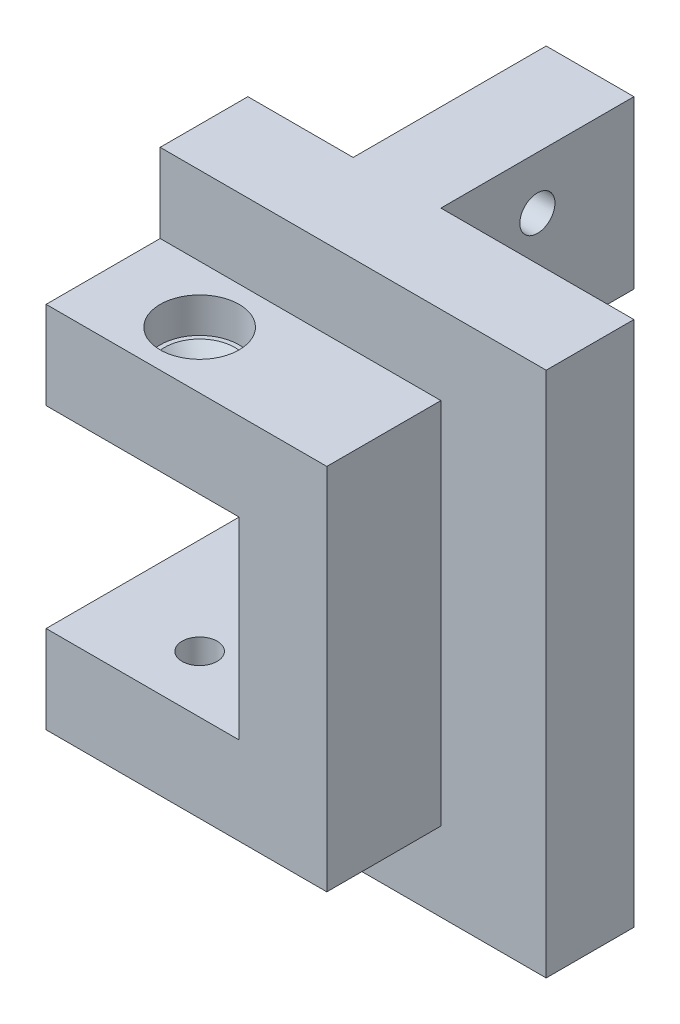
ISO-10303-21;
HEADER;
FILE_DESCRIPTION(('STEP AP214'),'2;1');
FILE_NAME('part.step','',(''),(''),'','','');
FILE_SCHEMA(('AUTOMOTIVE_DESIGN { 1 0 10303 214 1 1 1 1 }'));
ENDSEC;
DATA;
#1=APPLICATION_CONTEXT('core data for automotive mechanical design processes');
#2=APPLICATION_PROTOCOL_DEFINITION('international standard','automotive_design',2000,#1);
#3=PRODUCT_CONTEXT('',#1,'mechanical');
#4=PRODUCT('Part','Part','',(#3));
#5=PRODUCT_RELATED_PRODUCT_CATEGORY('part','',(#4));
#6=PRODUCT_DEFINITION_FORMATION('','',#4);
#7=PRODUCT_DEFINITION_CONTEXT('part definition',#1,'design');
#8=PRODUCT_DEFINITION('design','',#6,#7);
#9=PRODUCT_DEFINITION_SHAPE('','',#8);
#10=(LENGTH_UNIT() NAMED_UNIT(*) SI_UNIT(.MILLI.,.METRE.));
#11=(NAMED_UNIT(*) PLANE_ANGLE_UNIT() SI_UNIT($,.RADIAN.));
#12=(NAMED_UNIT(*) SI_UNIT($,.STERADIAN.) SOLID_ANGLE_UNIT());
#13=UNCERTAINTY_MEASURE_WITH_UNIT(LENGTH_MEASURE(1.E-05),#10,'distance_accuracy_value','');
#14=(GEOMETRIC_REPRESENTATION_CONTEXT(3) GLOBAL_UNCERTAINTY_ASSIGNED_CONTEXT((#13)) GLOBAL_UNIT_ASSIGNED_CONTEXT((#10,
#11,#12)) REPRESENTATION_CONTEXT('',''));
#15=CARTESIAN_POINT('',(0.,0.,0.));
#16=DIRECTION('',(0.,0.,1.));
#17=DIRECTION('',(1.,0.,0.));
#18=AXIS2_PLACEMENT_3D('',#15,#16,#17);
#19=CARTESIAN_POINT('',(-33.0000000000001,0.,16.5));
#20=DIRECTION('',(0.,-1.,0.));
#21=DIRECTION('',(0.,0.,-1.));
#22=AXIS2_PLACEMENT_3D('',#19,#20,#21);
#23=CYLINDRICAL_SURFACE('',#22,2.);
#24=CARTESIAN_POINT('',(-33.0000000000001,-15.,16.5));
#25=DIRECTION('',(0.,-1.,0.));
#26=DIRECTION('',(0.,0.,-1.));
#27=AXIS2_PLACEMENT_3D('',#24,#25,#26);
#28=CIRCLE('',#27,2.);
#29=CARTESIAN_POINT('',(-33.0000000000001,-15.,14.5));
#30=VERTEX_POINT('',#29);
#31=EDGE_CURVE('E394',#30,#30,#28,.T.);
#32=ORIENTED_EDGE('',*,*,#31,.T.);
#33=EDGE_LOOP('',(#32));
#34=FACE_BOUND('',#33,.T.);
#35=CARTESIAN_POINT('',(-33.0000000000001,-11.,16.5));
#36=DIRECTION('',(0.,-1.,0.));
#37=DIRECTION('',(1.,0.,0.));
#38=AXIS2_PLACEMENT_3D('',#35,#36,#37);
#39=CIRCLE('',#38,2.);
#40=CARTESIAN_POINT('',(-31.0000000000001,-11.,16.5));
#41=VERTEX_POINT('',#40);
#42=EDGE_CURVE('E305',#41,#41,#39,.T.);
#43=ORIENTED_EDGE('',*,*,#42,.F.);
#44=EDGE_LOOP('',(#43));
#45=FACE_BOUND('',#44,.T.);
#46=ADVANCED_FACE('F39',(#34,#45),#23,.F.);
#47=CARTESIAN_POINT('',(0.,0.,0.));
#48=DIRECTION('',(0.,0.,1.));
#49=DIRECTION('',(1.,0.,0.));
#50=AXIS2_PLACEMENT_3D('',#47,#48,#49);
#51=PLANE('',#50);
#52=DIRECTION('',(-1.,0.,0.));
#53=VECTOR('',#52,1.);
#54=CARTESIAN_POINT('',(0.,-30.,0.));
#55=LINE('',#54,#53);
#56=CARTESIAN_POINT('',(0.,-30.,0.));
#57=VERTEX_POINT('',#56);
#58=CARTESIAN_POINT('',(-22.,-30.,0.));
#59=VERTEX_POINT('',#58);
#60=EDGE_CURVE('E357',#57,#59,#55,.T.);
#61=ORIENTED_EDGE('',*,*,#60,.T.);
#62=DIRECTION('',(0.,1.,0.));
#63=VECTOR('',#62,1.);
#64=CARTESIAN_POINT('',(-22.,0.,0.));
#65=LINE('',#64,#63);
#66=CARTESIAN_POINT('',(-22.,-11.,0.));
#67=VERTEX_POINT('',#66);
#68=EDGE_CURVE('E388',#59,#67,#65,.T.);
#69=ORIENTED_EDGE('',*,*,#68,.T.);
#70=DIRECTION('',(0.,-1.,0.));
#71=VECTOR('',#70,1.);
#72=CARTESIAN_POINT('',(-22.,0.,0.));
#73=LINE('',#72,#71);
#74=CARTESIAN_POINT('',(-22.,11.,0.));
#75=VERTEX_POINT('',#74);
#76=EDGE_CURVE('E364',#75,#67,#73,.T.);
#77=ORIENTED_EDGE('',*,*,#76,.F.);
#78=DIRECTION('',(0.,-1.,0.));
#79=VECTOR('',#78,1.);
#80=CARTESIAN_POINT('',(-22.,0.,0.));
#81=LINE('',#80,#79);
#82=CARTESIAN_POINT('',(-22.,30.,0.));
#83=VERTEX_POINT('',#82);
#84=EDGE_CURVE('E275',#83,#75,#81,.T.);
#85=ORIENTED_EDGE('',*,*,#84,.F.);
#86=DIRECTION('',(-1.,0.,0.));
#87=VECTOR('',#86,1.);
#88=CARTESIAN_POINT('',(0.,30.,0.));
#89=LINE('',#88,#87);
#90=CARTESIAN_POINT('',(0.,30.,0.));
#91=VERTEX_POINT('',#90);
#92=EDGE_CURVE('E253',#91,#83,#89,.T.);
#93=ORIENTED_EDGE('',*,*,#92,.F.);
#94=DIRECTION('',(0.,-1.,0.));
#95=VECTOR('',#94,1.);
#96=CARTESIAN_POINT('',(0.,0.,0.));
#97=LINE('',#96,#95);
#98=EDGE_CURVE('E352',#91,#57,#97,.T.);
#99=ORIENTED_EDGE('',*,*,#98,.T.);
#100=EDGE_LOOP('',(#61,#69,#77,#85,#93,#99));
#101=FACE_BOUND('',#100,.T.);
#102=ADVANCED_FACE('F417',(#101),#51,.F.);
#103=CARTESIAN_POINT('',(0.,0.,10.));
#104=DIRECTION('',(1.,0.,0.));
#105=DIRECTION('',(0.,1.,0.));
#106=AXIS2_PLACEMENT_3D('',#103,#104,#105);
#107=PLANE('',#106);
#108=ORIENTED_EDGE('',*,*,#98,.F.);
#109=DIRECTION('',(0.,0.,-1.));
#110=VECTOR('',#109,1.);
#111=CARTESIAN_POINT('',(0.,30.,10.));
#112=LINE('',#111,#110);
#113=CARTESIAN_POINT('',(0.,30.,10.));
#114=VERTEX_POINT('',#113);
#115=EDGE_CURVE('E255',#114,#91,#112,.T.);
#116=ORIENTED_EDGE('',*,*,#115,.F.);
#117=DIRECTION('',(0.,-1.,0.));
#118=VECTOR('',#117,1.);
#119=CARTESIAN_POINT('',(0.,0.,10.));
#120=LINE('',#119,#118);
#121=CARTESIAN_POINT('',(0.,-30.,10.));
#122=VERTEX_POINT('',#121);
#123=EDGE_CURVE('E353',#114,#122,#120,.T.);
#124=ORIENTED_EDGE('',*,*,#123,.T.);
#125=DIRECTION('',(0.,0.,-1.));
#126=VECTOR('',#125,1.);
#127=CARTESIAN_POINT('',(0.,-30.,10.));
#128=LINE('',#127,#126);
#129=EDGE_CURVE('E361',#122,#57,#128,.T.);
#130=ORIENTED_EDGE('',*,*,#129,.T.);
#131=EDGE_LOOP('',(#108,#116,#124,#130));
#132=FACE_BOUND('',#131,.T.);
#133=ADVANCED_FACE('F423',(#132),#107,.T.);
#134=CARTESIAN_POINT('',(-22.,0.,10.));
#135=DIRECTION('',(1.,0.,0.));
#136=DIRECTION('',(0.,0.,-1.));
#137=AXIS2_PLACEMENT_3D('',#134,#135,#136);
#138=PLANE('',#137);
#139=ORIENTED_EDGE('',*,*,#76,.T.);
#140=DIRECTION('',(0.,0.,-1.));
#141=VECTOR('',#140,1.);
#142=CARTESIAN_POINT('',(-22.,-11.,10.));
#143=LINE('',#142,#141);
#144=CARTESIAN_POINT('',(-22.,-11.,23.));
#145=VERTEX_POINT('',#144);
#146=EDGE_CURVE('E379',#145,#67,#143,.T.);
#147=ORIENTED_EDGE('',*,*,#146,.F.);
#148=DIRECTION('',(0.,-1.,0.));
#149=VECTOR('',#148,1.);
#150=CARTESIAN_POINT('',(-22.,-11.,23.));
#151=LINE('',#150,#149);
#152=CARTESIAN_POINT('',(-22.,11.,23.));
#153=VERTEX_POINT('',#152);
#154=EDGE_CURVE('E314',#153,#145,#151,.T.);
#155=ORIENTED_EDGE('',*,*,#154,.F.);
#156=DIRECTION('',(0.,0.,-1.));
#157=VECTOR('',#156,1.);
#158=CARTESIAN_POINT('',(-22.,11.,10.));
#159=LINE('',#158,#157);
#160=EDGE_CURVE('E267',#153,#75,#159,.T.);
#161=ORIENTED_EDGE('',*,*,#160,.T.);
#162=EDGE_LOOP('',(#139,#147,#155,#161));
#163=FACE_BOUND('',#162,.T.);
#164=ADVANCED_FACE('F473',(#163),#138,.F.);
#165=CARTESIAN_POINT('',(0.,-11.,10.));
#166=DIRECTION('',(0.,-1.,0.));
#167=DIRECTION('',(1.,0.,0.));
#168=AXIS2_PLACEMENT_3D('',#165,#166,#167);
#169=PLANE('',#168);
#170=ORIENTED_EDGE('',*,*,#42,.T.);
#171=EDGE_LOOP('',(#170));
#172=FACE_BOUND('',#171,.T.);
#173=ORIENTED_EDGE('',*,*,#146,.T.);
#174=DIRECTION('',(0.,0.,1.));
#175=VECTOR('',#174,1.);
#176=CARTESIAN_POINT('',(-22.,-11.,-73.0688837074973));
#177=LINE('',#176,#175);
#178=CARTESIAN_POINT('',(-22.,-11.,-22.));
#179=VERTEX_POINT('',#178);
#180=EDGE_CURVE('E332',#179,#67,#177,.T.);
#181=ORIENTED_EDGE('',*,*,#180,.F.);
#182=DIRECTION('',(1.,0.,0.));
#183=VECTOR('',#182,1.);
#184=CARTESIAN_POINT('',(-44.0000000000001,-11.,-22.));
#185=LINE('',#184,#183);
#186=CARTESIAN_POINT('',(-44.0000000000001,-11.,-22.));
#187=VERTEX_POINT('',#186);
#188=EDGE_CURVE('E336',#187,#179,#185,.T.);
#189=ORIENTED_EDGE('',*,*,#188,.F.);
#190=DIRECTION('',(0.,0.,-1.));
#191=VECTOR('',#190,1.);
#192=CARTESIAN_POINT('',(-44.0000000000001,-11.,10.));
#193=LINE('',#192,#191);
#194=CARTESIAN_POINT('',(-44.0000000000001,-11.,23.));
#195=VERTEX_POINT('',#194);
#196=EDGE_CURVE('E377',#195,#187,#193,.T.);
#197=ORIENTED_EDGE('',*,*,#196,.F.);
#198=DIRECTION('',(-1.,0.,0.));
#199=VECTOR('',#198,1.);
#200=CARTESIAN_POINT('',(-44.0000000000001,-11.,23.));
#201=LINE('',#200,#199);
#202=EDGE_CURVE('E317',#145,#195,#201,.T.);
#203=ORIENTED_EDGE('',*,*,#202,.F.);
#204=EDGE_LOOP('',(#173,#181,#189,#197,#203));
#205=FACE_BOUND('',#204,.T.);
#206=ADVANCED_FACE('F469',(#172,#205),#169,.F.);
#207=CARTESIAN_POINT('',(-44.0000000000001,-1.92828209540159E-13,10.));
#208=DIRECTION('',(-1.,0.,0.));
#209=DIRECTION('',(0.,-1.,0.));
#210=AXIS2_PLACEMENT_3D('',#207,#208,#209);
#211=PLANE('',#210);
#212=DIRECTION('',(0.,1.,0.));
#213=VECTOR('',#212,1.);
#214=CARTESIAN_POINT('',(-44.0000000000001,-1.92828209540159E-13,10.));
#215=LINE('',#214,#213);
#216=CARTESIAN_POINT('',(-44.,-30.,10.));
#217=VERTEX_POINT('',#216);
#218=CARTESIAN_POINT('',(-44.,-21.,10.));
#219=VERTEX_POINT('',#218);
#220=EDGE_CURVE('E356',#217,#219,#215,.T.);
#221=ORIENTED_EDGE('',*,*,#220,.T.);
#222=DIRECTION('',(0.,0.,-1.));
#223=VECTOR('',#222,1.);
#224=CARTESIAN_POINT('',(-44.0000000000001,-21.,23.));
#225=LINE('',#224,#223);
#226=CARTESIAN_POINT('',(-44.0000000000001,-21.,23.));
#227=VERTEX_POINT('',#226);
#228=EDGE_CURVE('E325',#227,#219,#225,.T.);
#229=ORIENTED_EDGE('',*,*,#228,.F.);
#230=DIRECTION('',(0.,-1.,0.));
#231=VECTOR('',#230,1.);
#232=CARTESIAN_POINT('',(-44.0000000000001,-11.,23.));
#233=LINE('',#232,#231);
#234=EDGE_CURVE('E308',#195,#227,#233,.T.);
#235=ORIENTED_EDGE('',*,*,#234,.F.);
#236=ORIENTED_EDGE('',*,*,#196,.T.);
#237=DIRECTION('',(0.,1.,0.));
#238=VECTOR('',#237,1.);
#239=CARTESIAN_POINT('',(-44.0000000000001,-11.,-22.));
#240=LINE('',#239,#238);
#241=CARTESIAN_POINT('',(-44.0000000000001,-18.,-22.));
#242=VERTEX_POINT('',#241);
#243=EDGE_CURVE('E338',#242,#187,#240,.T.);
#244=ORIENTED_EDGE('',*,*,#243,.F.);
#245=DIRECTION('',(0.,0.,1.));
#246=VECTOR('',#245,1.);
#247=CARTESIAN_POINT('',(-44.0000000000001,-18.,-73.0688837074973));
#248=LINE('',#247,#246);
#249=CARTESIAN_POINT('',(-44.0000000000001,-18.,0.));
#250=VERTEX_POINT('',#249);
#251=EDGE_CURVE('E328',#242,#250,#248,.T.);
#252=ORIENTED_EDGE('',*,*,#251,.T.);
#253=DIRECTION('',(0.,1.,0.));
#254=VECTOR('',#253,1.);
#255=CARTESIAN_POINT('',(-44.0000000000001,-1.92828209540159E-13,0.));
#256=LINE('',#255,#254);
#257=CARTESIAN_POINT('',(-44.,-30.,0.));
#258=VERTEX_POINT('',#257);
#259=EDGE_CURVE('E367',#258,#250,#256,.T.);
#260=ORIENTED_EDGE('',*,*,#259,.F.);
#261=DIRECTION('',(0.,0.,-1.));
#262=VECTOR('',#261,1.);
#263=CARTESIAN_POINT('',(-44.,-30.,10.));
#264=LINE('',#263,#262);
#265=EDGE_CURVE('E374',#217,#258,#264,.T.);
#266=ORIENTED_EDGE('',*,*,#265,.F.);
#267=EDGE_LOOP('',(#221,#229,#235,#236,#244,#252,#260,#266));
#268=FACE_BOUND('',#267,.T.);
#269=ADVANCED_FACE('F465',(#268),#211,.T.);
#270=CARTESIAN_POINT('',(0.,-30.,10.));
#271=DIRECTION('',(0.,-1.,0.));
#272=DIRECTION('',(1.,0.,0.));
#273=AXIS2_PLACEMENT_3D('',#270,#271,#272);
#274=PLANE('',#273);
#275=CARTESIAN_POINT('',(-32.,-30.,0.));
#276=VERTEX_POINT('',#275);
#277=EDGE_CURVE('E370',#276,#258,#55,.T.);
#278=ORIENTED_EDGE('',*,*,#277,.F.);
#279=DIRECTION('',(0.,0.,1.));
#280=VECTOR('',#279,1.);
#281=CARTESIAN_POINT('',(-32.,-30.,-73.0688837074973));
#282=LINE('',#281,#280);
#283=CARTESIAN_POINT('',(-32.,-30.,-22.));
#284=VERTEX_POINT('',#283);
#285=EDGE_CURVE('E346',#284,#276,#282,.T.);
#286=ORIENTED_EDGE('',*,*,#285,.F.);
#287=DIRECTION('',(-1.,0.,0.));
#288=VECTOR('',#287,1.);
#289=CARTESIAN_POINT('',(-22.,-30.,-22.));
#290=LINE('',#289,#288);
#291=CARTESIAN_POINT('',(-22.,-30.,-22.));
#292=VERTEX_POINT('',#291);
#293=EDGE_CURVE('E331',#292,#284,#290,.T.);
#294=ORIENTED_EDGE('',*,*,#293,.F.);
#295=DIRECTION('',(0.,0.,1.));
#296=VECTOR('',#295,1.);
#297=CARTESIAN_POINT('',(-22.,-30.,-73.0688837074973));
#298=LINE('',#297,#296);
#299=EDGE_CURVE('E343',#292,#59,#298,.T.);
#300=ORIENTED_EDGE('',*,*,#299,.T.);
#301=ORIENTED_EDGE('',*,*,#60,.F.);
#302=ORIENTED_EDGE('',*,*,#129,.F.);
#303=DIRECTION('',(-1.,0.,0.));
#304=VECTOR('',#303,1.);
#305=CARTESIAN_POINT('',(0.,-30.,10.));
#306=LINE('',#305,#304);
#307=EDGE_CURVE('E359',#122,#217,#306,.T.);
#308=ORIENTED_EDGE('',*,*,#307,.T.);
#309=ORIENTED_EDGE('',*,*,#265,.T.);
#310=EDGE_LOOP('',(#278,#286,#294,#300,#301,#302,#308,#309));
#311=FACE_BOUND('',#310,.T.);
#312=ADVANCED_FACE('F459',(#311),#274,.T.);
#313=CARTESIAN_POINT('',(0.,0.,10.));
#314=DIRECTION('',(0.,0.,1.));
#315=DIRECTION('',(1.,0.,0.));
#316=AXIS2_PLACEMENT_3D('',#313,#314,#315);
#317=PLANE('',#316);
#318=DIRECTION('',(0.,1.,0.));
#319=VECTOR('',#318,1.);
#320=CARTESIAN_POINT('',(-12.,-21.,10.));
#321=LINE('',#320,#319);
#322=CARTESIAN_POINT('',(-12.,-21.,10.));
#323=VERTEX_POINT('',#322);
#324=CARTESIAN_POINT('',(-12.,21.,10.));
#325=VERTEX_POINT('',#324);
#326=EDGE_CURVE('E311',#323,#325,#321,.T.);
#327=ORIENTED_EDGE('',*,*,#326,.F.);
#328=DIRECTION('',(1.,0.,0.));
#329=VECTOR('',#328,1.);
#330=CARTESIAN_POINT('',(-44.0000000000001,-21.,10.));
#331=LINE('',#330,#329);
#332=EDGE_CURVE('E55',#219,#323,#331,.T.);
#333=ORIENTED_EDGE('',*,*,#332,.F.);
#334=ORIENTED_EDGE('',*,*,#220,.F.);
#335=ORIENTED_EDGE('',*,*,#307,.F.);
#336=ORIENTED_EDGE('',*,*,#123,.F.);
#337=DIRECTION('',(-1.,0.,0.));
#338=VECTOR('',#337,1.);
#339=CARTESIAN_POINT('',(0.,30.,10.));
#340=LINE('',#339,#338);
#341=CARTESIAN_POINT('',(-44.,30.,10.));
#342=VERTEX_POINT('',#341);
#343=EDGE_CURVE('E252',#114,#342,#340,.T.);
#344=ORIENTED_EDGE('',*,*,#343,.T.);
#345=DIRECTION('',(0.,-1.,0.));
#346=VECTOR('',#345,1.);
#347=CARTESIAN_POINT('',(-44.0000000000001,1.92828209540159E-13,10.));
#348=LINE('',#347,#346);
#349=CARTESIAN_POINT('',(-44.,21.,10.));
#350=VERTEX_POINT('',#349);
#351=EDGE_CURVE('E250',#342,#350,#348,.T.);
#352=ORIENTED_EDGE('',*,*,#351,.T.);
#353=DIRECTION('',(1.,0.,0.));
#354=VECTOR('',#353,1.);
#355=CARTESIAN_POINT('',(-44.0000000000001,21.,10.));
#356=LINE('',#355,#354);
#357=EDGE_CURVE('E203',#350,#325,#356,.T.);
#358=ORIENTED_EDGE('',*,*,#357,.T.);
#359=EDGE_LOOP('',(#327,#333,#334,#335,#336,#344,#352,#358));
#360=FACE_BOUND('',#359,.T.);
#361=ADVANCED_FACE('F457',(#360),#317,.T.);
#362=DIRECTION('',(1.,0.,0.));
#363=VECTOR('',#362,1.);
#364=CARTESIAN_POINT('',(0.,-18.,0.));
#365=LINE('',#364,#363);
#366=CARTESIAN_POINT('',(-32.,-18.,0.));
#367=VERTEX_POINT('',#366);
#368=EDGE_CURVE('E382',#250,#367,#365,.T.);
#369=ORIENTED_EDGE('',*,*,#368,.T.);
#370=DIRECTION('',(0.,-1.,0.));
#371=VECTOR('',#370,1.);
#372=CARTESIAN_POINT('',(-32.,0.,0.));
#373=LINE('',#372,#371);
#374=EDGE_CURVE('E385',#367,#276,#373,.T.);
#375=ORIENTED_EDGE('',*,*,#374,.T.);
#376=ORIENTED_EDGE('',*,*,#277,.T.);
#377=ORIENTED_EDGE('',*,*,#259,.T.);
#378=EDGE_LOOP('',(#369,#375,#376,#377));
#379=FACE_BOUND('',#378,.T.);
#380=ADVANCED_FACE('F427',(#379),#51,.F.);
#381=CARTESIAN_POINT('',(-22.,-11.,-73.0688837074973));
#382=DIRECTION('',(1.,0.,0.));
#383=DIRECTION('',(0.,1.,0.));
#384=AXIS2_PLACEMENT_3D('',#381,#382,#383);
#385=PLANE('',#384);
#386=CARTESIAN_POINT('',(-22.,-24.,-11.));
#387=DIRECTION('',(1.,0.,0.));
#388=DIRECTION('',(0.,1.,0.));
#389=AXIS2_PLACEMENT_3D('',#386,#387,#388);
#390=CIRCLE('',#389,2.);
#391=CARTESIAN_POINT('',(-22.,-22.,-11.));
#392=VERTEX_POINT('',#391);
#393=EDGE_CURVE('E302',#392,#392,#390,.T.);
#394=ORIENTED_EDGE('',*,*,#393,.F.);
#395=EDGE_LOOP('',(#394));
#396=FACE_BOUND('',#395,.T.);
#397=ORIENTED_EDGE('',*,*,#68,.F.);
#398=ORIENTED_EDGE('',*,*,#299,.F.);
#399=DIRECTION('',(0.,-1.,0.));
#400=VECTOR('',#399,1.);
#401=CARTESIAN_POINT('',(-22.,-11.,-22.));
#402=LINE('',#401,#400);
#403=EDGE_CURVE('E334',#179,#292,#402,.T.);
#404=ORIENTED_EDGE('',*,*,#403,.F.);
#405=ORIENTED_EDGE('',*,*,#180,.T.);
#406=EDGE_LOOP('',(#397,#398,#404,#405));
#407=FACE_BOUND('',#406,.T.);
#408=ADVANCED_FACE('F447',(#396,#407),#385,.T.);
#409=CARTESIAN_POINT('',(-32.,-18.,-73.0688837074973));
#410=DIRECTION('',(-1.,0.,0.));
#411=DIRECTION('',(0.,0.,1.));
#412=AXIS2_PLACEMENT_3D('',#409,#410,#411);
#413=PLANE('',#412);
#414=CARTESIAN_POINT('',(-32.,-24.,-11.));
#415=DIRECTION('',(-1.,0.,0.));
#416=DIRECTION('',(0.,0.,1.));
#417=AXIS2_PLACEMENT_3D('',#414,#415,#416);
#418=CIRCLE('',#417,4.5);
#419=CARTESIAN_POINT('',(-32.,-24.,-6.5));
#420=VERTEX_POINT('',#419);
#421=EDGE_CURVE('E296',#420,#420,#418,.T.);
#422=ORIENTED_EDGE('',*,*,#421,.F.);
#423=EDGE_LOOP('',(#422));
#424=FACE_BOUND('',#423,.T.);
#425=ORIENTED_EDGE('',*,*,#374,.F.);
#426=DIRECTION('',(0.,0.,1.));
#427=VECTOR('',#426,1.);
#428=CARTESIAN_POINT('',(-32.,-18.,-73.0688837074973));
#429=LINE('',#428,#427);
#430=CARTESIAN_POINT('',(-32.,-18.,-22.));
#431=VERTEX_POINT('',#430);
#432=EDGE_CURVE('E63',#431,#367,#429,.T.);
#433=ORIENTED_EDGE('',*,*,#432,.F.);
#434=DIRECTION('',(0.,1.,0.));
#435=VECTOR('',#434,1.);
#436=CARTESIAN_POINT('',(-32.,-18.,-22.));
#437=LINE('',#436,#435);
#438=EDGE_CURVE('E329',#284,#431,#437,.T.);
#439=ORIENTED_EDGE('',*,*,#438,.F.);
#440=ORIENTED_EDGE('',*,*,#285,.T.);
#441=EDGE_LOOP('',(#425,#433,#439,#440));
#442=FACE_BOUND('',#441,.T.);
#443=ADVANCED_FACE('F450',(#424,#442),#413,.T.);
#444=CARTESIAN_POINT('',(-44.0000000000001,-18.,-73.0688837074973));
#445=DIRECTION('',(0.,-1.,0.));
#446=DIRECTION('',(1.,0.,0.));
#447=AXIS2_PLACEMENT_3D('',#444,#445,#446);
#448=PLANE('',#447);
#449=ORIENTED_EDGE('',*,*,#368,.F.);
#450=ORIENTED_EDGE('',*,*,#251,.F.);
#451=DIRECTION('',(-1.,0.,0.));
#452=VECTOR('',#451,1.);
#453=CARTESIAN_POINT('',(-44.0000000000001,-18.,-22.));
#454=LINE('',#453,#452);
#455=EDGE_CURVE('E341',#431,#242,#454,.T.);
#456=ORIENTED_EDGE('',*,*,#455,.F.);
#457=ORIENTED_EDGE('',*,*,#432,.T.);
#458=EDGE_LOOP('',(#449,#450,#456,#457));
#459=FACE_BOUND('',#458,.T.);
#460=ADVANCED_FACE('F445',(#459),#448,.T.);
#461=CARTESIAN_POINT('',(0.,0.,-22.));
#462=DIRECTION('',(0.,0.,1.));
#463=DIRECTION('',(1.,0.,0.));
#464=AXIS2_PLACEMENT_3D('',#461,#462,#463);
#465=PLANE('',#464);
#466=ORIENTED_EDGE('',*,*,#243,.T.);
#467=ORIENTED_EDGE('',*,*,#188,.T.);
#468=ORIENTED_EDGE('',*,*,#403,.T.);
#469=ORIENTED_EDGE('',*,*,#293,.T.);
#470=ORIENTED_EDGE('',*,*,#438,.T.);
#471=ORIENTED_EDGE('',*,*,#455,.T.);
#472=EDGE_LOOP('',(#466,#467,#468,#469,#470,#471));
#473=FACE_BOUND('',#472,.T.);
#474=ADVANCED_FACE('F441',(#473),#465,.F.);
#475=CARTESIAN_POINT('',(-44.0000000000001,-21.,23.));
#476=DIRECTION('',(0.,1.,0.));
#477=DIRECTION('',(0.,0.,1.));
#478=AXIS2_PLACEMENT_3D('',#475,#476,#477);
#479=PLANE('',#478);
#480=CARTESIAN_POINT('',(-33.0000000000001,-21.,16.5));
#481=DIRECTION('',(0.,-1.,0.));
#482=DIRECTION('',(0.,0.,-1.));
#483=AXIS2_PLACEMENT_3D('',#480,#481,#482);
#484=CIRCLE('',#483,4.5);
#485=CARTESIAN_POINT('',(-33.0000000000001,-21.,12.));
#486=VERTEX_POINT('',#485);
#487=EDGE_CURVE('E290',#486,#486,#484,.T.);
#488=ORIENTED_EDGE('',*,*,#487,.F.);
#489=EDGE_LOOP('',(#488));
#490=FACE_BOUND('',#489,.T.);
#491=ORIENTED_EDGE('',*,*,#332,.T.);
#492=DIRECTION('',(0.,0.,-1.));
#493=VECTOR('',#492,1.);
#494=CARTESIAN_POINT('',(-12.,-21.,23.));
#495=LINE('',#494,#493);
#496=CARTESIAN_POINT('',(-12.,-21.,23.));
#497=VERTEX_POINT('',#496);
#498=EDGE_CURVE('E320',#497,#323,#495,.T.);
#499=ORIENTED_EDGE('',*,*,#498,.F.);
#500=DIRECTION('',(1.,0.,0.));
#501=VECTOR('',#500,1.);
#502=CARTESIAN_POINT('',(-44.0000000000001,-21.,23.));
#503=LINE('',#502,#501);
#504=EDGE_CURVE('E310',#227,#497,#503,.T.);
#505=ORIENTED_EDGE('',*,*,#504,.F.);
#506=ORIENTED_EDGE('',*,*,#228,.T.);
#507=EDGE_LOOP('',(#491,#499,#505,#506));
#508=FACE_BOUND('',#507,.T.);
#509=ADVANCED_FACE('F437',(#490,#508),#479,.F.);
#510=CARTESIAN_POINT('',(-12.,-21.,23.));
#511=DIRECTION('',(-1.,0.,0.));
#512=DIRECTION('',(0.,-1.,0.));
#513=AXIS2_PLACEMENT_3D('',#510,#511,#512);
#514=PLANE('',#513);
#515=ORIENTED_EDGE('',*,*,#326,.T.);
#516=DIRECTION('',(0.,0.,-1.));
#517=VECTOR('',#516,1.);
#518=CARTESIAN_POINT('',(-12.,21.,23.));
#519=LINE('',#518,#517);
#520=CARTESIAN_POINT('',(-12.,21.,23.));
#521=VERTEX_POINT('',#520);
#522=EDGE_CURVE('E208',#521,#325,#519,.T.);
#523=ORIENTED_EDGE('',*,*,#522,.F.);
#524=DIRECTION('',(0.,1.,0.));
#525=VECTOR('',#524,1.);
#526=CARTESIAN_POINT('',(-12.,-21.,23.));
#527=LINE('',#526,#525);
#528=EDGE_CURVE('E193',#497,#521,#527,.T.);
#529=ORIENTED_EDGE('',*,*,#528,.F.);
#530=ORIENTED_EDGE('',*,*,#498,.T.);
#531=EDGE_LOOP('',(#515,#523,#529,#530));
#532=FACE_BOUND('',#531,.T.);
#533=ADVANCED_FACE('F434',(#532),#514,.F.);
#534=CARTESIAN_POINT('',(0.,0.,23.));
#535=DIRECTION('',(0.,0.,1.));
#536=DIRECTION('',(1.,0.,0.));
#537=AXIS2_PLACEMENT_3D('',#534,#535,#536);
#538=PLANE('',#537);
#539=ORIENTED_EDGE('',*,*,#234,.T.);
#540=ORIENTED_EDGE('',*,*,#504,.T.);
#541=ORIENTED_EDGE('',*,*,#528,.T.);
#542=DIRECTION('',(1.,0.,0.));
#543=VECTOR('',#542,1.);
#544=CARTESIAN_POINT('',(-44.0000000000001,21.,23.));
#545=LINE('',#544,#543);
#546=CARTESIAN_POINT('',(-44.0000000000001,21.,23.));
#547=VERTEX_POINT('',#546);
#548=EDGE_CURVE('E184',#547,#521,#545,.T.);
#549=ORIENTED_EDGE('',*,*,#548,.F.);
#550=DIRECTION('',(0.,1.,0.));
#551=VECTOR('',#550,1.);
#552=CARTESIAN_POINT('',(-44.0000000000001,11.,23.));
#553=LINE('',#552,#551);
#554=CARTESIAN_POINT('',(-44.0000000000001,11.,23.));
#555=VERTEX_POINT('',#554);
#556=EDGE_CURVE('E190',#555,#547,#553,.T.);
#557=ORIENTED_EDGE('',*,*,#556,.F.);
#558=DIRECTION('',(-1.,0.,0.));
#559=VECTOR('',#558,1.);
#560=CARTESIAN_POINT('',(-44.0000000000001,11.,23.));
#561=LINE('',#560,#559);
#562=EDGE_CURVE('E197',#153,#555,#561,.T.);
#563=ORIENTED_EDGE('',*,*,#562,.F.);
#564=ORIENTED_EDGE('',*,*,#154,.T.);
#565=ORIENTED_EDGE('',*,*,#202,.T.);
#566=EDGE_LOOP('',(#539,#540,#541,#549,#557,#563,#564,#565));
#567=FACE_BOUND('',#566,.T.);
#568=ADVANCED_FACE('F187',(#567),#538,.T.);
#569=CARTESIAN_POINT('',(0.,-24.,-11.));
#570=DIRECTION('',(-1.,0.,0.));
#571=DIRECTION('',(0.,0.,1.));
#572=AXIS2_PLACEMENT_3D('',#569,#570,#571);
#573=CYLINDRICAL_SURFACE('',#572,2.);
#574=CARTESIAN_POINT('',(-26.,-24.,-11.));
#575=DIRECTION('',(1.,0.,0.));
#576=DIRECTION('',(0.,0.,-1.));
#577=AXIS2_PLACEMENT_3D('',#574,#575,#576);
#578=CIRCLE('',#577,2.);
#579=CARTESIAN_POINT('',(-26.,-24.,-13.));
#580=VERTEX_POINT('',#579);
#581=EDGE_CURVE('E48',#580,#580,#578,.F.);
#582=ORIENTED_EDGE('',*,*,#581,.T.);
#583=EDGE_LOOP('',(#582));
#584=FACE_BOUND('',#583,.T.);
#585=ORIENTED_EDGE('',*,*,#393,.T.);
#586=EDGE_LOOP('',(#585));
#587=FACE_BOUND('',#586,.T.);
#588=ADVANCED_FACE('F399',(#584,#587),#573,.F.);
#589=CARTESIAN_POINT('',(-28.,-11.,-73.0688837074973));
#590=DIRECTION('',(1.,0.,0.));
#591=DIRECTION('',(0.,1.,0.));
#592=AXIS2_PLACEMENT_3D('',#589,#590,#591);
#593=PLANE('',#592);
#594=CARTESIAN_POINT('',(-28.,-24.,-11.));
#595=DIRECTION('',(1.,0.,0.));
#596=DIRECTION('',(0.,1.,0.));
#597=AXIS2_PLACEMENT_3D('',#594,#595,#596);
#598=CIRCLE('',#597,4.);
#599=CARTESIAN_POINT('',(-28.,-20.,-11.));
#600=VERTEX_POINT('',#599);
#601=EDGE_CURVE('E12',#600,#600,#598,.T.);
#602=ORIENTED_EDGE('',*,*,#601,.T.);
#603=EDGE_LOOP('',(#602));
#604=FACE_BOUND('',#603,.T.);
#605=CARTESIAN_POINT('',(-28.,-24.,-11.));
#606=DIRECTION('',(1.,0.,0.));
#607=DIRECTION('',(0.,1.,0.));
#608=AXIS2_PLACEMENT_3D('',#605,#606,#607);
#609=CIRCLE('',#608,4.5);
#610=CARTESIAN_POINT('',(-28.,-19.5,-11.));
#611=VERTEX_POINT('',#610);
#612=EDGE_CURVE('E299',#611,#611,#609,.F.);
#613=ORIENTED_EDGE('',*,*,#612,.T.);
#614=EDGE_LOOP('',(#613));
#615=FACE_BOUND('',#614,.T.);
#616=ADVANCED_FACE('F564',(#604,#615),#593,.F.);
#617=CARTESIAN_POINT('',(-9.27207793864217,-24.,-11.));
#618=DIRECTION('',(-1.,0.,0.));
#619=DIRECTION('',(0.,0.,1.));
#620=AXIS2_PLACEMENT_3D('',#617,#618,#619);
#621=CYLINDRICAL_SURFACE('',#620,4.5);
#622=ORIENTED_EDGE('',*,*,#421,.T.);
#623=EDGE_LOOP('',(#622));
#624=FACE_BOUND('',#623,.T.);
#625=ORIENTED_EDGE('',*,*,#612,.F.);
#626=EDGE_LOOP('',(#625));
#627=FACE_BOUND('',#626,.T.);
#628=ADVANCED_FACE('F558',(#624,#627),#621,.F.);
#629=CARTESIAN_POINT('',(0.,-17.,10.));
#630=DIRECTION('',(0.,-1.,0.));
#631=DIRECTION('',(1.,0.,0.));
#632=AXIS2_PLACEMENT_3D('',#629,#630,#631);
#633=PLANE('',#632);
#634=CARTESIAN_POINT('',(-33.0000000000001,-17.,16.5));
#635=DIRECTION('',(0.,-1.,0.));
#636=DIRECTION('',(1.,0.,0.));
#637=AXIS2_PLACEMENT_3D('',#634,#635,#636);
#638=CIRCLE('',#637,3.99999999999999);
#639=CARTESIAN_POINT('',(-29.0000000000001,-17.,16.5));
#640=VERTEX_POINT('',#639);
#641=EDGE_CURVE('E391',#640,#640,#638,.F.);
#642=ORIENTED_EDGE('',*,*,#641,.T.);
#643=EDGE_LOOP('',(#642));
#644=FACE_BOUND('',#643,.T.);
#645=CARTESIAN_POINT('',(-33.0000000000001,-17.,16.5));
#646=DIRECTION('',(0.,-1.,0.));
#647=DIRECTION('',(1.,0.,0.));
#648=AXIS2_PLACEMENT_3D('',#645,#646,#647);
#649=CIRCLE('',#648,4.5);
#650=CARTESIAN_POINT('',(-28.5000000000001,-17.,16.5));
#651=VERTEX_POINT('',#650);
#652=EDGE_CURVE('E293',#651,#651,#649,.F.);
#653=ORIENTED_EDGE('',*,*,#652,.F.);
#654=EDGE_LOOP('',(#653));
#655=FACE_BOUND('',#654,.T.);
#656=ADVANCED_FACE('F555',(#644,#655),#633,.T.);
#657=CARTESIAN_POINT('',(-33.0000000000001,1.72792206135786,16.5));
#658=DIRECTION('',(0.,-1.,0.));
#659=DIRECTION('',(0.,0.,-1.));
#660=AXIS2_PLACEMENT_3D('',#657,#658,#659);
#661=CYLINDRICAL_SURFACE('',#660,4.5);
#662=ORIENTED_EDGE('',*,*,#652,.T.);
#663=EDGE_LOOP('',(#662));
#664=FACE_BOUND('',#663,.T.);
#665=ORIENTED_EDGE('',*,*,#487,.T.);
#666=EDGE_LOOP('',(#665));
#667=FACE_BOUND('',#666,.T.);
#668=ADVANCED_FACE('F413',(#664,#667),#661,.F.);
#669=CARTESIAN_POINT('',(-33.0000000000001,-17.,16.5));
#670=DIRECTION('',(0.,-1.,0.));
#671=DIRECTION('',(0.,0.,-1.));
#672=AXIS2_PLACEMENT_3D('',#669,#670,#671);
#673=CONICAL_SURFACE('',#672,4.,0.785398163397445);
#674=ORIENTED_EDGE('',*,*,#31,.F.);
#675=EDGE_LOOP('',(#674));
#676=FACE_BOUND('',#675,.T.);
#677=ORIENTED_EDGE('',*,*,#641,.F.);
#678=EDGE_LOOP('',(#677));
#679=FACE_BOUND('',#678,.T.);
#680=ADVANCED_FACE('F404',(#676,#679),#673,.F.);
#681=CARTESIAN_POINT('',(-26.,-24.,-11.));
#682=DIRECTION('',(-1.,0.,0.));
#683=DIRECTION('',(0.,0.,1.));
#684=AXIS2_PLACEMENT_3D('',#681,#682,#683);
#685=CONICAL_SURFACE('',#684,2.,0.78539816339745);
#686=ORIENTED_EDGE('',*,*,#601,.F.);
#687=EDGE_LOOP('',(#686));
#688=FACE_BOUND('',#687,.T.);
#689=ORIENTED_EDGE('',*,*,#581,.F.);
#690=EDGE_LOOP('',(#689));
#691=FACE_BOUND('',#690,.T.);
#692=ADVANCED_FACE('F42',(#688,#691),#685,.F.);
#693=CARTESIAN_POINT('',(-33.0000000000001,0.,16.5));
#694=DIRECTION('',(0.,1.,0.));
#695=DIRECTION('',(0.,0.,-1.));
#696=AXIS2_PLACEMENT_3D('',#693,#694,#695);
#697=CYLINDRICAL_SURFACE('',#696,2.);
#698=CARTESIAN_POINT('',(-33.0000000000001,15.,16.5));
#699=DIRECTION('',(0.,-1.,0.));
#700=DIRECTION('',(0.,0.,-1.));
#701=AXIS2_PLACEMENT_3D('',#698,#699,#700);
#702=CIRCLE('',#701,2.);
#703=CARTESIAN_POINT('',(-33.0000000000001,15.,14.5));
#704=VERTEX_POINT('',#703);
#705=EDGE_CURVE('E281',#704,#704,#702,.T.);
#706=ORIENTED_EDGE('',*,*,#705,.F.);
#707=EDGE_LOOP('',(#706));
#708=FACE_BOUND('',#707,.T.);
#709=CARTESIAN_POINT('',(-33.0000000000001,11.,16.5));
#710=DIRECTION('',(0.,-1.,0.));
#711=DIRECTION('',(1.,0.,0.));
#712=AXIS2_PLACEMENT_3D('',#709,#710,#711);
#713=CIRCLE('',#712,2.);
#714=CARTESIAN_POINT('',(-31.0000000000001,11.,16.5));
#715=VERTEX_POINT('',#714);
#716=EDGE_CURVE('E215',#715,#715,#713,.T.);
#717=ORIENTED_EDGE('',*,*,#716,.T.);
#718=EDGE_LOOP('',(#717));
#719=FACE_BOUND('',#718,.T.);
#720=ADVANCED_FACE('F403',(#708,#719),#697,.F.);
#721=CARTESIAN_POINT('',(0.,11.,10.));
#722=DIRECTION('',(0.,1.,0.));
#723=DIRECTION('',(1.,0.,0.));
#724=AXIS2_PLACEMENT_3D('',#721,#722,#723);
#725=PLANE('',#724);
#726=ORIENTED_EDGE('',*,*,#716,.F.);
#727=EDGE_LOOP('',(#726));
#728=FACE_BOUND('',#727,.T.);
#729=ORIENTED_EDGE('',*,*,#160,.F.);
#730=ORIENTED_EDGE('',*,*,#562,.T.);
#731=DIRECTION('',(0.,0.,-1.));
#732=VECTOR('',#731,1.);
#733=CARTESIAN_POINT('',(-44.0000000000001,11.,10.));
#734=LINE('',#733,#732);
#735=CARTESIAN_POINT('',(-44.0000000000001,11.,-22.));
#736=VERTEX_POINT('',#735);
#737=EDGE_CURVE('E212',#555,#736,#734,.T.);
#738=ORIENTED_EDGE('',*,*,#737,.T.);
#739=DIRECTION('',(1.,0.,0.));
#740=VECTOR('',#739,1.);
#741=CARTESIAN_POINT('',(-44.0000000000001,11.,-22.));
#742=LINE('',#741,#740);
#743=CARTESIAN_POINT('',(-22.,11.,-22.));
#744=VERTEX_POINT('',#743);
#745=EDGE_CURVE('E231',#736,#744,#742,.T.);
#746=ORIENTED_EDGE('',*,*,#745,.T.);
#747=DIRECTION('',(0.,0.,1.));
#748=VECTOR('',#747,1.);
#749=CARTESIAN_POINT('',(-22.,11.,-73.0688837074973));
#750=LINE('',#749,#748);
#751=EDGE_CURVE('E226',#744,#75,#750,.T.);
#752=ORIENTED_EDGE('',*,*,#751,.T.);
#753=EDGE_LOOP('',(#729,#730,#738,#746,#752));
#754=FACE_BOUND('',#753,.T.);
#755=ADVANCED_FACE('F410',(#728,#754),#725,.F.);
#756=CARTESIAN_POINT('',(-44.0000000000001,1.92828209540159E-13,10.));
#757=DIRECTION('',(-1.,0.,0.));
#758=DIRECTION('',(0.,1.,0.));
#759=AXIS2_PLACEMENT_3D('',#756,#757,#758);
#760=PLANE('',#759);
#761=ORIENTED_EDGE('',*,*,#351,.F.);
#762=DIRECTION('',(0.,0.,-1.));
#763=VECTOR('',#762,1.);
#764=CARTESIAN_POINT('',(-44.,30.,10.));
#765=LINE('',#764,#763);
#766=CARTESIAN_POINT('',(-44.,30.,0.));
#767=VERTEX_POINT('',#766);
#768=EDGE_CURVE('E263',#342,#767,#765,.T.);
#769=ORIENTED_EDGE('',*,*,#768,.T.);
#770=DIRECTION('',(0.,-1.,0.));
#771=VECTOR('',#770,1.);
#772=CARTESIAN_POINT('',(-44.0000000000001,1.92828209540159E-13,0.));
#773=LINE('',#772,#771);
#774=CARTESIAN_POINT('',(-44.0000000000001,18.,0.));
#775=VERTEX_POINT('',#774);
#776=EDGE_CURVE('E249',#767,#775,#773,.T.);
#777=ORIENTED_EDGE('',*,*,#776,.T.);
#778=DIRECTION('',(0.,0.,1.));
#779=VECTOR('',#778,1.);
#780=CARTESIAN_POINT('',(-44.0000000000001,18.,-73.0688837074973));
#781=LINE('',#780,#779);
#782=CARTESIAN_POINT('',(-44.0000000000001,18.,-22.));
#783=VERTEX_POINT('',#782);
#784=EDGE_CURVE('E207',#783,#775,#781,.T.);
#785=ORIENTED_EDGE('',*,*,#784,.F.);
#786=DIRECTION('',(0.,-1.,0.));
#787=VECTOR('',#786,1.);
#788=CARTESIAN_POINT('',(-44.0000000000001,11.,-22.));
#789=LINE('',#788,#787);
#790=EDGE_CURVE('E234',#783,#736,#789,.T.);
#791=ORIENTED_EDGE('',*,*,#790,.T.);
#792=ORIENTED_EDGE('',*,*,#737,.F.);
#793=ORIENTED_EDGE('',*,*,#556,.T.);
#794=DIRECTION('',(0.,0.,-1.));
#795=VECTOR('',#794,1.);
#796=CARTESIAN_POINT('',(-44.0000000000001,21.,23.));
#797=LINE('',#796,#795);
#798=EDGE_CURVE('E200',#547,#350,#797,.T.);
#799=ORIENTED_EDGE('',*,*,#798,.T.);
#800=EDGE_LOOP('',(#761,#769,#777,#785,#791,#792,#793,#799));
#801=FACE_BOUND('',#800,.T.);
#802=ADVANCED_FACE('F210',(#801),#760,.T.);
#803=CARTESIAN_POINT('',(0.,30.,10.));
#804=DIRECTION('',(0.,1.,0.));
#805=DIRECTION('',(1.,0.,0.));
#806=AXIS2_PLACEMENT_3D('',#803,#804,#805);
#807=PLANE('',#806);
#808=CARTESIAN_POINT('',(-32.,30.,0.));
#809=VERTEX_POINT('',#808);
#810=EDGE_CURVE('E258',#809,#767,#89,.T.);
#811=ORIENTED_EDGE('',*,*,#810,.T.);
#812=ORIENTED_EDGE('',*,*,#768,.F.);
#813=ORIENTED_EDGE('',*,*,#343,.F.);
#814=ORIENTED_EDGE('',*,*,#115,.T.);
#815=ORIENTED_EDGE('',*,*,#92,.T.);
#816=DIRECTION('',(0.,0.,1.));
#817=VECTOR('',#816,1.);
#818=CARTESIAN_POINT('',(-22.,30.,-73.0688837074973));
#819=LINE('',#818,#817);
#820=CARTESIAN_POINT('',(-22.,30.,-22.));
#821=VERTEX_POINT('',#820);
#822=EDGE_CURVE('E239',#821,#83,#819,.T.);
#823=ORIENTED_EDGE('',*,*,#822,.F.);
#824=DIRECTION('',(-1.,0.,0.));
#825=VECTOR('',#824,1.);
#826=CARTESIAN_POINT('',(-22.,30.,-22.));
#827=LINE('',#826,#825);
#828=CARTESIAN_POINT('',(-32.,30.,-22.));
#829=VERTEX_POINT('',#828);
#830=EDGE_CURVE('E225',#821,#829,#827,.T.);
#831=ORIENTED_EDGE('',*,*,#830,.T.);
#832=DIRECTION('',(0.,0.,1.));
#833=VECTOR('',#832,1.);
#834=CARTESIAN_POINT('',(-32.,30.,-73.0688837074973));
#835=LINE('',#834,#833);
#836=EDGE_CURVE('E241',#829,#809,#835,.T.);
#837=ORIENTED_EDGE('',*,*,#836,.T.);
#838=EDGE_LOOP('',(#811,#812,#813,#814,#815,#823,#831,#837));
#839=FACE_BOUND('',#838,.T.);
#840=ADVANCED_FACE('F492',(#839),#807,.T.);
#841=DIRECTION('',(1.,0.,0.));
#842=VECTOR('',#841,1.);
#843=CARTESIAN_POINT('',(0.,18.,0.));
#844=LINE('',#843,#842);
#845=CARTESIAN_POINT('',(-32.,18.,0.));
#846=VERTEX_POINT('',#845);
#847=EDGE_CURVE('E270',#775,#846,#844,.T.);
#848=ORIENTED_EDGE('',*,*,#847,.F.);
#849=ORIENTED_EDGE('',*,*,#776,.F.);
#850=ORIENTED_EDGE('',*,*,#810,.F.);
#851=DIRECTION('',(0.,1.,0.));
#852=VECTOR('',#851,1.);
#853=CARTESIAN_POINT('',(-32.,0.,0.));
#854=LINE('',#853,#852);
#855=EDGE_CURVE('E273',#846,#809,#854,.T.);
#856=ORIENTED_EDGE('',*,*,#855,.F.);
#857=EDGE_LOOP('',(#848,#849,#850,#856));
#858=FACE_BOUND('',#857,.T.);
#859=ADVANCED_FACE('F426',(#858),#51,.F.);
#860=CARTESIAN_POINT('',(-22.,11.,-73.0688837074973));
#861=DIRECTION('',(1.,0.,0.));
#862=DIRECTION('',(0.,-1.,0.));
#863=AXIS2_PLACEMENT_3D('',#860,#861,#862);
#864=PLANE('',#863);
#865=CARTESIAN_POINT('',(-22.,24.,-11.));
#866=DIRECTION('',(-1.,0.,0.));
#867=DIRECTION('',(0.,-1.,0.));
#868=AXIS2_PLACEMENT_3D('',#865,#866,#867);
#869=CIRCLE('',#868,2.);
#870=CARTESIAN_POINT('',(-22.,22.,-11.));
#871=VERTEX_POINT('',#870);
#872=EDGE_CURVE('E893',#871,#871,#869,.T.);
#873=ORIENTED_EDGE('',*,*,#872,.T.);
#874=EDGE_LOOP('',(#873));
#875=FACE_BOUND('',#874,.T.);
#876=ORIENTED_EDGE('',*,*,#84,.T.);
#877=ORIENTED_EDGE('',*,*,#751,.F.);
#878=DIRECTION('',(0.,1.,0.));
#879=VECTOR('',#878,1.);
#880=CARTESIAN_POINT('',(-22.,11.,-22.));
#881=LINE('',#880,#879);
#882=EDGE_CURVE('E229',#744,#821,#881,.T.);
#883=ORIENTED_EDGE('',*,*,#882,.T.);
#884=ORIENTED_EDGE('',*,*,#822,.T.);
#885=EDGE_LOOP('',(#876,#877,#883,#884));
#886=FACE_BOUND('',#885,.T.);
#887=ADVANCED_FACE('F498',(#875,#886),#864,.T.);
#888=CARTESIAN_POINT('',(-32.,18.,-73.0688837074973));
#889=DIRECTION('',(-1.,0.,0.));
#890=DIRECTION('',(0.,0.,1.));
#891=AXIS2_PLACEMENT_3D('',#888,#889,#890);
#892=PLANE('',#891);
#893=CARTESIAN_POINT('',(-32.,24.,-11.));
#894=DIRECTION('',(1.,0.,0.));
#895=DIRECTION('',(0.,0.,1.));
#896=AXIS2_PLACEMENT_3D('',#893,#894,#895);
#897=CIRCLE('',#896,4.5);
#898=CARTESIAN_POINT('',(-32.,24.,-6.5));
#899=VERTEX_POINT('',#898);
#900=EDGE_CURVE('E886',#899,#899,#897,.T.);
#901=ORIENTED_EDGE('',*,*,#900,.T.);
#902=EDGE_LOOP('',(#901));
#903=FACE_BOUND('',#902,.T.);
#904=ORIENTED_EDGE('',*,*,#855,.T.);
#905=ORIENTED_EDGE('',*,*,#836,.F.);
#906=DIRECTION('',(0.,-1.,0.));
#907=VECTOR('',#906,1.);
#908=CARTESIAN_POINT('',(-32.,18.,-22.));
#909=LINE('',#908,#907);
#910=CARTESIAN_POINT('',(-32.,18.,-22.));
#911=VERTEX_POINT('',#910);
#912=EDGE_CURVE('E222',#829,#911,#909,.T.);
#913=ORIENTED_EDGE('',*,*,#912,.T.);
#914=DIRECTION('',(0.,0.,1.));
#915=VECTOR('',#914,1.);
#916=CARTESIAN_POINT('',(-32.,18.,-73.0688837074973));
#917=LINE('',#916,#915);
#918=EDGE_CURVE('E244',#911,#846,#917,.T.);
#919=ORIENTED_EDGE('',*,*,#918,.T.);
#920=EDGE_LOOP('',(#904,#905,#913,#919));
#921=FACE_BOUND('',#920,.T.);
#922=ADVANCED_FACE('F508',(#903,#921),#892,.T.);
#923=CARTESIAN_POINT('',(-44.0000000000001,18.,-73.0688837074973));
#924=DIRECTION('',(0.,1.,0.));
#925=DIRECTION('',(1.,0.,0.));
#926=AXIS2_PLACEMENT_3D('',#923,#924,#925);
#927=PLANE('',#926);
#928=ORIENTED_EDGE('',*,*,#847,.T.);
#929=ORIENTED_EDGE('',*,*,#918,.F.);
#930=DIRECTION('',(-1.,0.,0.));
#931=VECTOR('',#930,1.);
#932=CARTESIAN_POINT('',(-44.0000000000001,18.,-22.));
#933=LINE('',#932,#931);
#934=EDGE_CURVE('E236',#911,#783,#933,.T.);
#935=ORIENTED_EDGE('',*,*,#934,.T.);
#936=ORIENTED_EDGE('',*,*,#784,.T.);
#937=EDGE_LOOP('',(#928,#929,#935,#936));
#938=FACE_BOUND('',#937,.T.);
#939=ADVANCED_FACE('F513',(#938),#927,.T.);
#940=CARTESIAN_POINT('',(0.,0.,-22.));
#941=DIRECTION('',(0.,0.,1.));
#942=DIRECTION('',(1.,0.,0.));
#943=AXIS2_PLACEMENT_3D('',#940,#941,#942);
#944=PLANE('',#943);
#945=ORIENTED_EDGE('',*,*,#790,.F.);
#946=ORIENTED_EDGE('',*,*,#934,.F.);
#947=ORIENTED_EDGE('',*,*,#912,.F.);
#948=ORIENTED_EDGE('',*,*,#830,.F.);
#949=ORIENTED_EDGE('',*,*,#882,.F.);
#950=ORIENTED_EDGE('',*,*,#745,.F.);
#951=EDGE_LOOP('',(#945,#946,#947,#948,#949,#950));
#952=FACE_BOUND('',#951,.T.);
#953=ADVANCED_FACE('F504',(#952),#944,.F.);
#954=CARTESIAN_POINT('',(-44.0000000000001,21.,23.));
#955=DIRECTION('',(0.,-1.,0.));
#956=DIRECTION('',(0.,0.,1.));
#957=AXIS2_PLACEMENT_3D('',#954,#955,#956);
#958=PLANE('',#957);
#959=CARTESIAN_POINT('',(-33.0000000000001,21.,16.5));
#960=DIRECTION('',(0.,-1.,0.));
#961=DIRECTION('',(0.,0.,-1.));
#962=AXIS2_PLACEMENT_3D('',#959,#960,#961);
#963=CIRCLE('',#962,4.5);
#964=CARTESIAN_POINT('',(-33.0000000000001,21.,12.));
#965=VERTEX_POINT('',#964);
#966=EDGE_CURVE('E884',#965,#965,#963,.T.);
#967=ORIENTED_EDGE('',*,*,#966,.T.);
#968=EDGE_LOOP('',(#967));
#969=FACE_BOUND('',#968,.T.);
#970=ORIENTED_EDGE('',*,*,#357,.F.);
#971=ORIENTED_EDGE('',*,*,#798,.F.);
#972=ORIENTED_EDGE('',*,*,#548,.T.);
#973=ORIENTED_EDGE('',*,*,#522,.T.);
#974=EDGE_LOOP('',(#970,#971,#972,#973));
#975=FACE_BOUND('',#974,.T.);
#976=ADVANCED_FACE('F201',(#969,#975),#958,.F.);
#977=CARTESIAN_POINT('',(0.,24.,-11.));
#978=DIRECTION('',(-1.,0.,0.));
#979=DIRECTION('',(0.,0.,1.));
#980=AXIS2_PLACEMENT_3D('',#977,#978,#979);
#981=CYLINDRICAL_SURFACE('',#980,2.);
#982=CARTESIAN_POINT('',(-26.,24.,-11.));
#983=DIRECTION('',(-1.,0.,0.));
#984=DIRECTION('',(0.,0.,-1.));
#985=AXIS2_PLACEMENT_3D('',#982,#983,#984);
#986=CIRCLE('',#985,2.);
#987=CARTESIAN_POINT('',(-26.,24.,-13.));
#988=VERTEX_POINT('',#987);
#989=EDGE_CURVE('E284',#988,#988,#986,.F.);
#990=ORIENTED_EDGE('',*,*,#989,.F.);
#991=EDGE_LOOP('',(#990));
#992=FACE_BOUND('',#991,.T.);
#993=ORIENTED_EDGE('',*,*,#872,.F.);
#994=EDGE_LOOP('',(#993));
#995=FACE_BOUND('',#994,.T.);
#996=ADVANCED_FACE('F807',(#992,#995),#981,.F.);
#997=CARTESIAN_POINT('',(-28.,11.,-73.0688837074973));
#998=DIRECTION('',(1.,0.,0.));
#999=DIRECTION('',(0.,-1.,0.));
#1000=AXIS2_PLACEMENT_3D('',#997,#998,#999);
#1001=PLANE('',#1000);
#1002=CARTESIAN_POINT('',(-28.,24.,-11.));
#1003=DIRECTION('',(-1.,0.,0.));
#1004=DIRECTION('',(0.,-1.,0.));
#1005=AXIS2_PLACEMENT_3D('',#1002,#1003,#1004);
#1006=CIRCLE('',#1005,4.);
#1007=CARTESIAN_POINT('',(-28.,20.,-11.));
#1008=VERTEX_POINT('',#1007);
#1009=EDGE_CURVE('E287',#1008,#1008,#1006,.T.);
#1010=ORIENTED_EDGE('',*,*,#1009,.F.);
#1011=EDGE_LOOP('',(#1010));
#1012=FACE_BOUND('',#1011,.T.);
#1013=CARTESIAN_POINT('',(-28.,24.,-11.));
#1014=DIRECTION('',(-1.,0.,0.));
#1015=DIRECTION('',(0.,-1.,0.));
#1016=AXIS2_PLACEMENT_3D('',#1013,#1014,#1015);
#1017=CIRCLE('',#1016,4.5);
#1018=CARTESIAN_POINT('',(-28.,19.5,-11.));
#1019=VERTEX_POINT('',#1018);
#1020=EDGE_CURVE('E891',#1019,#1019,#1017,.F.);
#1021=ORIENTED_EDGE('',*,*,#1020,.F.);
#1022=EDGE_LOOP('',(#1021));
#1023=FACE_BOUND('',#1022,.T.);
#1024=ADVANCED_FACE('F816',(#1012,#1023),#1001,.F.);
#1025=CARTESIAN_POINT('',(-9.27207793864217,24.,-11.));
#1026=DIRECTION('',(-1.,0.,0.));
#1027=DIRECTION('',(0.,0.,1.));
#1028=AXIS2_PLACEMENT_3D('',#1025,#1026,#1027);
#1029=CYLINDRICAL_SURFACE('',#1028,4.5);
#1030=ORIENTED_EDGE('',*,*,#900,.F.);
#1031=EDGE_LOOP('',(#1030));
#1032=FACE_BOUND('',#1031,.T.);
#1033=ORIENTED_EDGE('',*,*,#1020,.T.);
#1034=EDGE_LOOP('',(#1033));
#1035=FACE_BOUND('',#1034,.T.);
#1036=ADVANCED_FACE('F825',(#1032,#1035),#1029,.F.);
#1037=CARTESIAN_POINT('',(0.,17.,10.));
#1038=DIRECTION('',(0.,1.,0.));
#1039=DIRECTION('',(1.,0.,0.));
#1040=AXIS2_PLACEMENT_3D('',#1037,#1038,#1039);
#1041=PLANE('',#1040);
#1042=CARTESIAN_POINT('',(-33.0000000000001,17.,16.5));
#1043=DIRECTION('',(0.,-1.,0.));
#1044=DIRECTION('',(1.,0.,0.));
#1045=AXIS2_PLACEMENT_3D('',#1042,#1043,#1044);
#1046=CIRCLE('',#1045,3.99999999999999);
#1047=CARTESIAN_POINT('',(-29.0000000000001,17.,16.5));
#1048=VERTEX_POINT('',#1047);
#1049=EDGE_CURVE('E278',#1048,#1048,#1046,.F.);
#1050=ORIENTED_EDGE('',*,*,#1049,.F.);
#1051=EDGE_LOOP('',(#1050));
#1052=FACE_BOUND('',#1051,.T.);
#1053=CARTESIAN_POINT('',(-33.0000000000001,17.,16.5));
#1054=DIRECTION('',(0.,-1.,0.));
#1055=DIRECTION('',(1.,0.,0.));
#1056=AXIS2_PLACEMENT_3D('',#1053,#1054,#1055);
#1057=CIRCLE('',#1056,4.5);
#1058=CARTESIAN_POINT('',(-28.5000000000001,17.,16.5));
#1059=VERTEX_POINT('',#1058);
#1060=EDGE_CURVE('E881',#1059,#1059,#1057,.F.);
#1061=ORIENTED_EDGE('',*,*,#1060,.T.);
#1062=EDGE_LOOP('',(#1061));
#1063=FACE_BOUND('',#1062,.T.);
#1064=ADVANCED_FACE('F834',(#1052,#1063),#1041,.T.);
#1065=CARTESIAN_POINT('',(-33.0000000000001,-1.72792206135786,16.5));
#1066=DIRECTION('',(0.,1.,0.));
#1067=DIRECTION('',(0.,0.,-1.));
#1068=AXIS2_PLACEMENT_3D('',#1065,#1066,#1067);
#1069=CYLINDRICAL_SURFACE('',#1068,4.5);
#1070=ORIENTED_EDGE('',*,*,#1060,.F.);
#1071=EDGE_LOOP('',(#1070));
#1072=FACE_BOUND('',#1071,.T.);
#1073=ORIENTED_EDGE('',*,*,#966,.F.);
#1074=EDGE_LOOP('',(#1073));
#1075=FACE_BOUND('',#1074,.T.);
#1076=ADVANCED_FACE('F550',(#1072,#1075),#1069,.F.);
#1077=CARTESIAN_POINT('',(-33.0000000000001,17.,16.5));
#1078=DIRECTION('',(0.,1.,0.));
#1079=DIRECTION('',(0.,0.,-1.));
#1080=AXIS2_PLACEMENT_3D('',#1077,#1078,#1079);
#1081=CONICAL_SURFACE('',#1080,4.,0.785398163397445);
#1082=ORIENTED_EDGE('',*,*,#705,.T.);
#1083=EDGE_LOOP('',(#1082));
#1084=FACE_BOUND('',#1083,.T.);
#1085=ORIENTED_EDGE('',*,*,#1049,.T.);
#1086=EDGE_LOOP('',(#1085));
#1087=FACE_BOUND('',#1086,.T.);
#1088=ADVANCED_FACE('F546',(#1084,#1087),#1081,.F.);
#1089=CARTESIAN_POINT('',(-26.,24.,-11.));
#1090=DIRECTION('',(-1.,0.,0.));
#1091=DIRECTION('',(0.,0.,1.));
#1092=AXIS2_PLACEMENT_3D('',#1089,#1090,#1091);
#1093=CONICAL_SURFACE('',#1092,2.,0.78539816339745);
#1094=ORIENTED_EDGE('',*,*,#1009,.T.);
#1095=EDGE_LOOP('',(#1094));
#1096=FACE_BOUND('',#1095,.T.);
#1097=ORIENTED_EDGE('',*,*,#989,.T.);
#1098=EDGE_LOOP('',(#1097));
#1099=FACE_BOUND('',#1098,.T.);
#1100=ADVANCED_FACE('F549',(#1096,#1099),#1093,.F.);
#1101=CLOSED_SHELL('',(#46,#102,#133,#164,#206,#269,#312,#361,#380,#408,#443,#460,#474,#509,
#533,#568,#588,#616,#628,#656,#668,#680,#692,#720,#755,#802,#840,#859,#887,#922,#939,#953,#976,
#996,#1024,#1036,#1064,#1076,#1088,#1100));
#1102=MANIFOLD_SOLID_BREP('B2',#1101);
#1103=ADVANCED_BREP_SHAPE_REPRESENTATION('',(#18,#1102),#14);
#1104=SHAPE_DEFINITION_REPRESENTATION(#9,#1103);
ENDSEC;
END-ISO-10303-21;
